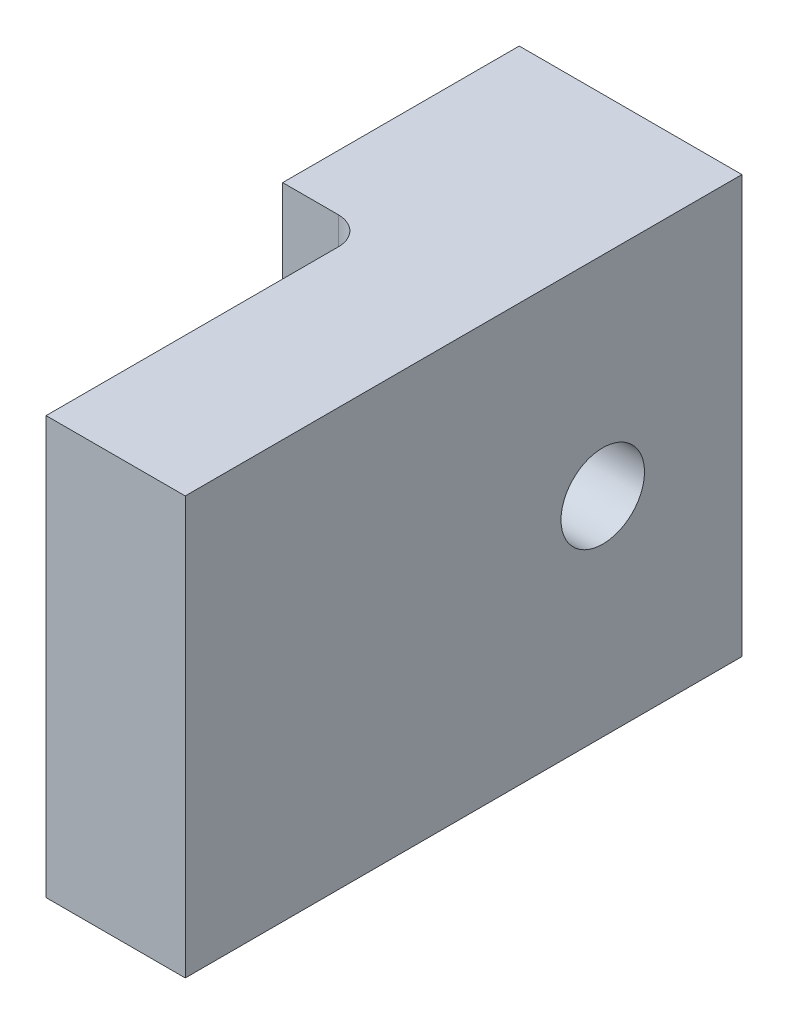
ISO-10303-21;
HEADER;
FILE_DESCRIPTION(('STEP AP214'),'2;1');
FILE_NAME('part.step','',(''),(''),'','','');
FILE_SCHEMA(('AUTOMOTIVE_DESIGN { 1 0 10303 214 1 1 1 1 }'));
ENDSEC;
DATA;
#1=APPLICATION_CONTEXT('core data for automotive mechanical design processes');
#2=APPLICATION_PROTOCOL_DEFINITION('international standard','automotive_design',2000,#1);
#3=PRODUCT_CONTEXT('',#1,'mechanical');
#4=PRODUCT('Part','Part','',(#3));
#5=PRODUCT_RELATED_PRODUCT_CATEGORY('part','',(#4));
#6=PRODUCT_DEFINITION_FORMATION('','',#4);
#7=PRODUCT_DEFINITION_CONTEXT('part definition',#1,'design');
#8=PRODUCT_DEFINITION('design','',#6,#7);
#9=PRODUCT_DEFINITION_SHAPE('','',#8);
#10=(LENGTH_UNIT() NAMED_UNIT(*) SI_UNIT(.MILLI.,.METRE.));
#11=(NAMED_UNIT(*) PLANE_ANGLE_UNIT() SI_UNIT($,.RADIAN.));
#12=(NAMED_UNIT(*) SI_UNIT($,.STERADIAN.) SOLID_ANGLE_UNIT());
#13=UNCERTAINTY_MEASURE_WITH_UNIT(LENGTH_MEASURE(1.E-05),#10,'distance_accuracy_value','');
#14=(GEOMETRIC_REPRESENTATION_CONTEXT(3) GLOBAL_UNCERTAINTY_ASSIGNED_CONTEXT((#13)) GLOBAL_UNIT_ASSIGNED_CONTEXT((#10,
#11,#12)) REPRESENTATION_CONTEXT('',''));
#15=CARTESIAN_POINT('',(0.,0.,0.));
#16=DIRECTION('',(0.,0.,1.));
#17=DIRECTION('',(1.,0.,0.));
#18=AXIS2_PLACEMENT_3D('',#15,#16,#17);
#19=CARTESIAN_POINT('',(-5.74789915966386,15.,-4.55882352941177));
#20=DIRECTION('',(1.,0.,0.));
#21=DIRECTION('',(0.,0.,-1.));
#22=AXIS2_PLACEMENT_3D('',#19,#20,#21);
#23=PLANE('',#22);
#24=CARTESIAN_POINT('',(-5.74789915966386,7.5,-8.05882352941177));
#25=DIRECTION('',(-1.,0.,0.));
#26=DIRECTION('',(0.,0.,1.));
#27=AXIS2_PLACEMENT_3D('',#24,#25,#26);
#28=CIRCLE('',#27,1.5);
#29=CARTESIAN_POINT('',(-5.74789915966386,7.5,-6.55882352941177));
#30=VERTEX_POINT('',#29);
#31=EDGE_CURVE('E128',#30,#30,#28,.T.);
#32=ORIENTED_EDGE('',*,*,#31,.F.);
#33=EDGE_LOOP('',(#32));
#34=FACE_BOUND('',#33,.T.);
#35=DIRECTION('',(0.,0.,1.));
#36=VECTOR('',#35,1.);
#37=CARTESIAN_POINT('',(-5.74789915966386,0.,-4.55882352941177));
#38=LINE('',#37,#36);
#39=CARTESIAN_POINT('',(-5.74789915966386,0.,-13.0588235294118));
#40=VERTEX_POINT('',#39);
#41=CARTESIAN_POINT('',(-5.74789915966386,0.,-4.55882352941177));
#42=VERTEX_POINT('',#41);
#43=EDGE_CURVE('E115',#40,#42,#38,.T.);
#44=ORIENTED_EDGE('',*,*,#43,.T.);
#45=DIRECTION('',(0.,-1.,0.));
#46=VECTOR('',#45,1.);
#47=CARTESIAN_POINT('',(-5.74789915966386,15.,-4.55882352941177));
#48=LINE('',#47,#46);
#49=CARTESIAN_POINT('',(-5.74789915966386,15.,-4.55882352941177));
#50=VERTEX_POINT('',#49);
#51=EDGE_CURVE('E98',#50,#42,#48,.T.);
#52=ORIENTED_EDGE('',*,*,#51,.F.);
#53=DIRECTION('',(0.,0.,1.));
#54=VECTOR('',#53,1.);
#55=CARTESIAN_POINT('',(-5.74789915966386,15.,-4.55882352941177));
#56=LINE('',#55,#54);
#57=CARTESIAN_POINT('',(-5.74789915966386,15.,-13.0588235294118));
#58=VERTEX_POINT('',#57);
#59=EDGE_CURVE('E103',#58,#50,#56,.T.);
#60=ORIENTED_EDGE('',*,*,#59,.F.);
#61=DIRECTION('',(0.,-1.,0.));
#62=VECTOR('',#61,1.);
#63=CARTESIAN_POINT('',(-5.74789915966386,15.,-13.0588235294118));
#64=LINE('',#63,#62);
#65=EDGE_CURVE('E144',#58,#40,#64,.T.);
#66=ORIENTED_EDGE('',*,*,#65,.T.);
#67=EDGE_LOOP('',(#44,#52,#60,#66));
#68=FACE_BOUND('',#67,.T.);
#69=ADVANCED_FACE('F39',(#34,#68),#23,.F.);
#70=CARTESIAN_POINT('',(-2.74789915966386,15.,-4.55882352941177));
#71=DIRECTION('',(0.,0.,-1.));
#72=DIRECTION('',(-1.,0.,0.));
#73=AXIS2_PLACEMENT_3D('',#70,#71,#72);
#74=PLANE('',#73);
#75=DIRECTION('',(1.,0.,0.));
#76=VECTOR('',#75,1.);
#77=CARTESIAN_POINT('',(-2.74789915966386,0.,-4.55882352941177));
#78=LINE('',#77,#76);
#79=CARTESIAN_POINT('',(-3.74789915966386,0.,-4.55882352941177));
#80=VERTEX_POINT('',#79);
#81=EDGE_CURVE('E132',#42,#80,#78,.T.);
#82=ORIENTED_EDGE('',*,*,#81,.T.);
#83=DIRECTION('',(0.,-1.,0.));
#84=VECTOR('',#83,1.);
#85=CARTESIAN_POINT('',(-3.74789915966386,15.,-4.55882352941177));
#86=LINE('',#85,#84);
#87=CARTESIAN_POINT('',(-3.74789915966386,15.,-4.55882352941177));
#88=VERTEX_POINT('',#87);
#89=EDGE_CURVE('E54',#80,#88,#86,.F.);
#90=ORIENTED_EDGE('',*,*,#89,.T.);
#91=DIRECTION('',(1.,0.,0.));
#92=VECTOR('',#91,1.);
#93=CARTESIAN_POINT('',(-2.74789915966386,15.,-4.55882352941177));
#94=LINE('',#93,#92);
#95=EDGE_CURVE('E94',#50,#88,#94,.T.);
#96=ORIENTED_EDGE('',*,*,#95,.F.);
#97=ORIENTED_EDGE('',*,*,#51,.T.);
#98=EDGE_LOOP('',(#82,#90,#96,#97));
#99=FACE_BOUND('',#98,.T.);
#100=ADVANCED_FACE('F96',(#99),#74,.F.);
#101=CARTESIAN_POINT('',(-2.74789915966386,15.,6.94117647058823));
#102=DIRECTION('',(1.,0.,0.));
#103=DIRECTION('',(0.,0.,-1.));
#104=AXIS2_PLACEMENT_3D('',#101,#102,#103);
#105=PLANE('',#104);
#106=DIRECTION('',(0.,0.,1.));
#107=VECTOR('',#106,1.);
#108=CARTESIAN_POINT('',(-2.74789915966386,15.,6.94117647058823));
#109=LINE('',#108,#107);
#110=CARTESIAN_POINT('',(-2.74789915966386,15.,-3.55882352941177));
#111=VERTEX_POINT('',#110);
#112=CARTESIAN_POINT('',(-2.74789915966386,15.,6.94117647058823));
#113=VERTEX_POINT('',#112);
#114=EDGE_CURVE('E102',#111,#113,#109,.T.);
#115=ORIENTED_EDGE('',*,*,#114,.F.);
#116=DIRECTION('',(0.,-1.,0.));
#117=VECTOR('',#116,1.);
#118=CARTESIAN_POINT('',(-2.74789915966386,0.,-3.55882352941177));
#119=LINE('',#118,#117);
#120=CARTESIAN_POINT('',(-2.74789915966386,0.,-3.55882352941177));
#121=VERTEX_POINT('',#120);
#122=EDGE_CURVE('E116',#111,#121,#119,.T.);
#123=ORIENTED_EDGE('',*,*,#122,.T.);
#124=DIRECTION('',(0.,0.,1.));
#125=VECTOR('',#124,1.);
#126=CARTESIAN_POINT('',(-2.74789915966386,0.,6.94117647058823));
#127=LINE('',#126,#125);
#128=CARTESIAN_POINT('',(-2.74789915966386,0.,6.94117647058823));
#129=VERTEX_POINT('',#128);
#130=EDGE_CURVE('E147',#121,#129,#127,.T.);
#131=ORIENTED_EDGE('',*,*,#130,.T.);
#132=DIRECTION('',(0.,-1.,0.));
#133=VECTOR('',#132,1.);
#134=CARTESIAN_POINT('',(-2.74789915966386,15.,6.94117647058823));
#135=LINE('',#134,#133);
#136=EDGE_CURVE('E117',#113,#129,#135,.T.);
#137=ORIENTED_EDGE('',*,*,#136,.F.);
#138=EDGE_LOOP('',(#115,#123,#131,#137));
#139=FACE_BOUND('',#138,.T.);
#140=ADVANCED_FACE('F186',(#139),#105,.F.);
#141=CARTESIAN_POINT('',(2.25210084033614,15.,6.94117647058824));
#142=DIRECTION('',(0.,0.,-1.));
#143=DIRECTION('',(-1.,0.,0.));
#144=AXIS2_PLACEMENT_3D('',#141,#142,#143);
#145=PLANE('',#144);
#146=DIRECTION('',(1.,0.,0.));
#147=VECTOR('',#146,1.);
#148=CARTESIAN_POINT('',(2.25210084033614,0.,6.94117647058824));
#149=LINE('',#148,#147);
#150=CARTESIAN_POINT('',(2.25210084033614,0.,6.94117647058824));
#151=VERTEX_POINT('',#150);
#152=EDGE_CURVE('E149',#129,#151,#149,.T.);
#153=ORIENTED_EDGE('',*,*,#152,.T.);
#154=DIRECTION('',(0.,-1.,0.));
#155=VECTOR('',#154,1.);
#156=CARTESIAN_POINT('',(2.25210084033614,15.,6.94117647058824));
#157=LINE('',#156,#155);
#158=CARTESIAN_POINT('',(2.25210084033614,15.,6.94117647058824));
#159=VERTEX_POINT('',#158);
#160=EDGE_CURVE('E122',#159,#151,#157,.T.);
#161=ORIENTED_EDGE('',*,*,#160,.F.);
#162=DIRECTION('',(1.,0.,0.));
#163=VECTOR('',#162,1.);
#164=CARTESIAN_POINT('',(2.25210084033614,15.,6.94117647058824));
#165=LINE('',#164,#163);
#166=EDGE_CURVE('E140',#113,#159,#165,.T.);
#167=ORIENTED_EDGE('',*,*,#166,.F.);
#168=ORIENTED_EDGE('',*,*,#136,.T.);
#169=EDGE_LOOP('',(#153,#161,#167,#168));
#170=FACE_BOUND('',#169,.T.);
#171=ADVANCED_FACE('F178',(#170),#145,.F.);
#172=CARTESIAN_POINT('',(2.25210084033614,15.,-13.0588235294118));
#173=DIRECTION('',(-1.,0.,0.));
#174=DIRECTION('',(0.,0.,1.));
#175=AXIS2_PLACEMENT_3D('',#172,#173,#174);
#176=PLANE('',#175);
#177=CARTESIAN_POINT('',(2.25210084033614,7.5,-8.05882352941177));
#178=DIRECTION('',(-1.,0.,0.));
#179=DIRECTION('',(0.,0.,1.));
#180=AXIS2_PLACEMENT_3D('',#177,#178,#179);
#181=CIRCLE('',#180,1.5);
#182=CARTESIAN_POINT('',(2.25210084033614,7.5,-6.55882352941177));
#183=VERTEX_POINT('',#182);
#184=EDGE_CURVE('E126',#183,#183,#181,.T.);
#185=ORIENTED_EDGE('',*,*,#184,.T.);
#186=EDGE_LOOP('',(#185));
#187=FACE_BOUND('',#186,.T.);
#188=DIRECTION('',(0.,0.,-1.));
#189=VECTOR('',#188,1.);
#190=CARTESIAN_POINT('',(2.25210084033614,0.,-13.0588235294118));
#191=LINE('',#190,#189);
#192=CARTESIAN_POINT('',(2.25210084033614,0.,-13.0588235294118));
#193=VERTEX_POINT('',#192);
#194=EDGE_CURVE('E151',#151,#193,#191,.T.);
#195=ORIENTED_EDGE('',*,*,#194,.T.);
#196=DIRECTION('',(0.,-1.,0.));
#197=VECTOR('',#196,1.);
#198=CARTESIAN_POINT('',(2.25210084033614,15.,-13.0588235294118));
#199=LINE('',#198,#197);
#200=CARTESIAN_POINT('',(2.25210084033614,15.,-13.0588235294118));
#201=VERTEX_POINT('',#200);
#202=EDGE_CURVE('E155',#201,#193,#199,.T.);
#203=ORIENTED_EDGE('',*,*,#202,.F.);
#204=DIRECTION('',(0.,0.,-1.));
#205=VECTOR('',#204,1.);
#206=CARTESIAN_POINT('',(2.25210084033614,15.,-13.0588235294118));
#207=LINE('',#206,#205);
#208=EDGE_CURVE('E142',#159,#201,#207,.T.);
#209=ORIENTED_EDGE('',*,*,#208,.F.);
#210=ORIENTED_EDGE('',*,*,#160,.T.);
#211=EDGE_LOOP('',(#195,#203,#209,#210));
#212=FACE_BOUND('',#211,.T.);
#213=ADVANCED_FACE('F162',(#187,#212),#176,.F.);
#214=CARTESIAN_POINT('',(-5.74789915966386,15.,-13.0588235294118));
#215=DIRECTION('',(0.,0.,1.));
#216=DIRECTION('',(1.,0.,0.));
#217=AXIS2_PLACEMENT_3D('',#214,#215,#216);
#218=PLANE('',#217);
#219=DIRECTION('',(-1.,0.,0.));
#220=VECTOR('',#219,1.);
#221=CARTESIAN_POINT('',(-5.74789915966386,0.,-13.0588235294118));
#222=LINE('',#221,#220);
#223=EDGE_CURVE('E112',#193,#40,#222,.T.);
#224=ORIENTED_EDGE('',*,*,#223,.T.);
#225=ORIENTED_EDGE('',*,*,#65,.F.);
#226=DIRECTION('',(-1.,0.,0.));
#227=VECTOR('',#226,1.);
#228=CARTESIAN_POINT('',(-5.74789915966386,15.,-13.0588235294118));
#229=LINE('',#228,#227);
#230=EDGE_CURVE('E108',#201,#58,#229,.T.);
#231=ORIENTED_EDGE('',*,*,#230,.F.);
#232=ORIENTED_EDGE('',*,*,#202,.T.);
#233=EDGE_LOOP('',(#224,#225,#231,#232));
#234=FACE_BOUND('',#233,.T.);
#235=ADVANCED_FACE('F170',(#234),#218,.F.);
#236=CARTESIAN_POINT('',(0.,15.,0.));
#237=DIRECTION('',(0.,-1.,0.));
#238=DIRECTION('',(0.,0.,-1.));
#239=AXIS2_PLACEMENT_3D('',#236,#237,#238);
#240=PLANE('',#239);
#241=ORIENTED_EDGE('',*,*,#59,.T.);
#242=ORIENTED_EDGE('',*,*,#95,.T.);
#243=CARTESIAN_POINT('',(-3.74789915966386,15.,-3.55882352941177));
#244=DIRECTION('',(0.,-1.,0.));
#245=DIRECTION('',(0.,0.,-1.));
#246=AXIS2_PLACEMENT_3D('',#243,#244,#245);
#247=CIRCLE('',#246,1.);
#248=EDGE_CURVE('E11',#88,#111,#247,.T.);
#249=ORIENTED_EDGE('',*,*,#248,.T.);
#250=ORIENTED_EDGE('',*,*,#114,.T.);
#251=ORIENTED_EDGE('',*,*,#166,.T.);
#252=ORIENTED_EDGE('',*,*,#208,.T.);
#253=ORIENTED_EDGE('',*,*,#230,.T.);
#254=EDGE_LOOP('',(#241,#242,#249,#250,#251,#252,#253));
#255=FACE_BOUND('',#254,.T.);
#256=ADVANCED_FACE('F106',(#255),#240,.F.);
#257=CARTESIAN_POINT('',(0.,0.,0.));
#258=DIRECTION('',(0.,-1.,0.));
#259=DIRECTION('',(0.,0.,-1.));
#260=AXIS2_PLACEMENT_3D('',#257,#258,#259);
#261=PLANE('',#260);
#262=ORIENTED_EDGE('',*,*,#43,.F.);
#263=ORIENTED_EDGE('',*,*,#223,.F.);
#264=ORIENTED_EDGE('',*,*,#194,.F.);
#265=ORIENTED_EDGE('',*,*,#152,.F.);
#266=ORIENTED_EDGE('',*,*,#130,.F.);
#267=CARTESIAN_POINT('',(-3.74789915966386,0.,-3.55882352941177));
#268=DIRECTION('',(0.,-1.,0.));
#269=DIRECTION('',(0.,0.,-1.));
#270=AXIS2_PLACEMENT_3D('',#267,#268,#269);
#271=CIRCLE('',#270,1.);
#272=EDGE_CURVE('E47',#121,#80,#271,.F.);
#273=ORIENTED_EDGE('',*,*,#272,.T.);
#274=ORIENTED_EDGE('',*,*,#81,.F.);
#275=EDGE_LOOP('',(#262,#263,#264,#265,#266,#273,#274));
#276=FACE_BOUND('',#275,.T.);
#277=ADVANCED_FACE('F168',(#276),#261,.T.);
#278=CARTESIAN_POINT('',(9.25210084033614,7.5,-8.05882352941177));
#279=DIRECTION('',(-1.,0.,0.));
#280=DIRECTION('',(0.,0.,1.));
#281=AXIS2_PLACEMENT_3D('',#278,#279,#280);
#282=CYLINDRICAL_SURFACE('',#281,1.5);
#283=ORIENTED_EDGE('',*,*,#31,.T.);
#284=EDGE_LOOP('',(#283));
#285=FACE_BOUND('',#284,.T.);
#286=ORIENTED_EDGE('',*,*,#184,.F.);
#287=EDGE_LOOP('',(#286));
#288=FACE_BOUND('',#287,.T.);
#289=ADVANCED_FACE('F200',(#285,#288),#282,.F.);
#290=CARTESIAN_POINT('',(-3.74789915966386,15.,-3.55882352941177));
#291=DIRECTION('',(0.,1.,0.));
#292=DIRECTION('',(0.,0.,1.));
#293=AXIS2_PLACEMENT_3D('',#290,#291,#292);
#294=CYLINDRICAL_SURFACE('',#293,1.);
#295=ORIENTED_EDGE('',*,*,#248,.F.);
#296=ORIENTED_EDGE('',*,*,#89,.F.);
#297=ORIENTED_EDGE('',*,*,#272,.F.);
#298=ORIENTED_EDGE('',*,*,#122,.F.);
#299=EDGE_LOOP('',(#295,#296,#297,#298));
#300=FACE_BOUND('',#299,.T.);
#301=ADVANCED_FACE('F41',(#300),#294,.F.);
#302=CLOSED_SHELL('',(#69,#100,#140,#171,#213,#235,#256,#277,#289,#301));
#303=MANIFOLD_SOLID_BREP('B2',#302);
#304=ADVANCED_BREP_SHAPE_REPRESENTATION('',(#18,#303),#14);
#305=SHAPE_DEFINITION_REPRESENTATION(#9,#304);
ENDSEC;
END-ISO-10303-21;
